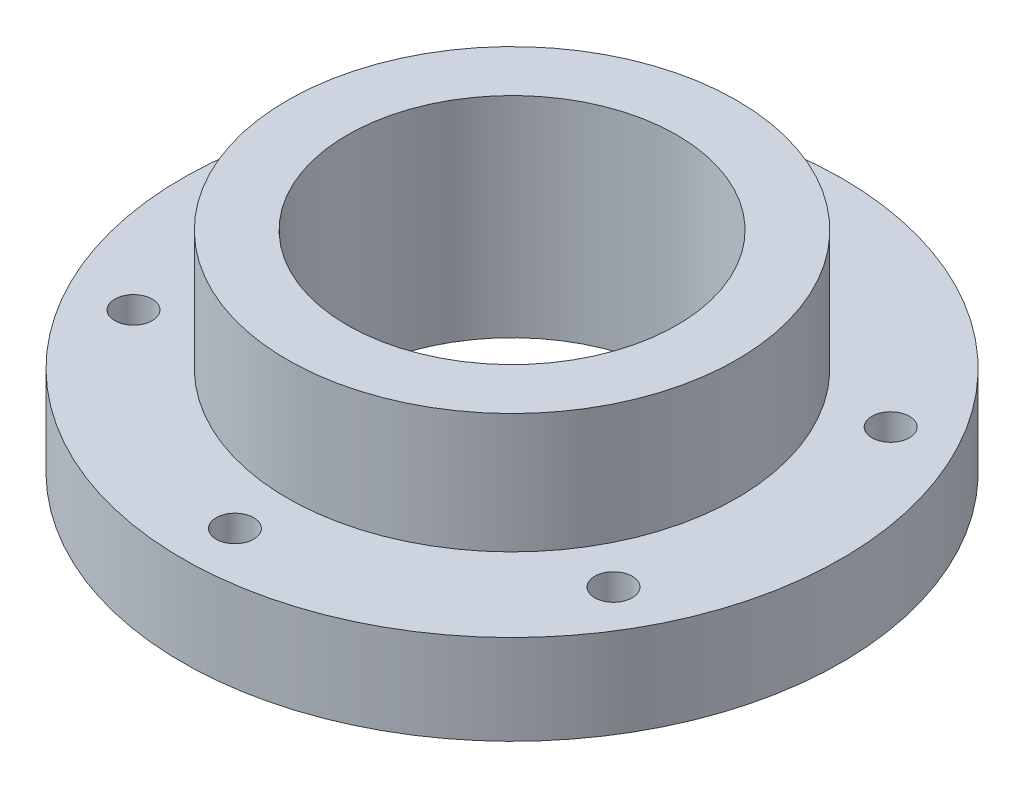
ISO-10303-21;
HEADER;
FILE_DESCRIPTION(('STEP AP214'),'2;1');
FILE_NAME('part.step','',(''),(''),'','','');
FILE_SCHEMA(('AUTOMOTIVE_DESIGN { 1 0 10303 214 1 1 1 1 }'));
ENDSEC;
DATA;
#1=APPLICATION_CONTEXT('core data for automotive mechanical design processes');
#2=APPLICATION_PROTOCOL_DEFINITION('international standard','automotive_design',2000,#1);
#3=PRODUCT_CONTEXT('',#1,'mechanical');
#4=PRODUCT('Part','Part','',(#3));
#5=PRODUCT_RELATED_PRODUCT_CATEGORY('part','',(#4));
#6=PRODUCT_DEFINITION_FORMATION('','',#4);
#7=PRODUCT_DEFINITION_CONTEXT('part definition',#1,'design');
#8=PRODUCT_DEFINITION('design','',#6,#7);
#9=PRODUCT_DEFINITION_SHAPE('','',#8);
#10=(LENGTH_UNIT() NAMED_UNIT(*) SI_UNIT(.MILLI.,.METRE.));
#11=(NAMED_UNIT(*) PLANE_ANGLE_UNIT() SI_UNIT($,.RADIAN.));
#12=(NAMED_UNIT(*) SI_UNIT($,.STERADIAN.) SOLID_ANGLE_UNIT());
#13=UNCERTAINTY_MEASURE_WITH_UNIT(LENGTH_MEASURE(1.E-05),#10,'distance_accuracy_value','');
#14=(GEOMETRIC_REPRESENTATION_CONTEXT(3) GLOBAL_UNCERTAINTY_ASSIGNED_CONTEXT((#13)) GLOBAL_UNIT_ASSIGNED_CONTEXT((#10,
#11,#12)) REPRESENTATION_CONTEXT('',''));
#15=CARTESIAN_POINT('',(0.,0.,0.));
#16=DIRECTION('',(0.,0.,1.));
#17=DIRECTION('',(1.,0.,0.));
#18=AXIS2_PLACEMENT_3D('',#15,#16,#17);
#19=CARTESIAN_POINT('',(22.,0.,0.));
#20=DIRECTION('',(0.,-1.,0.));
#21=DIRECTION('',(0.,0.,-1.));
#22=AXIS2_PLACEMENT_3D('',#19,#20,#21);
#23=PLANE('',#22);
#24=CARTESIAN_POINT('',(0.,0.,-18.5));
#25=DIRECTION('',(0.,-1.,0.));
#26=DIRECTION('',(0.,0.,-1.));
#27=AXIS2_PLACEMENT_3D('',#24,#25,#26);
#28=CIRCLE('',#27,1.25);
#29=CARTESIAN_POINT('',(0.,0.,-19.75));
#30=VERTEX_POINT('',#29);
#31=EDGE_CURVE('E56',#30,#30,#28,.T.);
#32=ORIENTED_EDGE('',*,*,#31,.F.);
#33=EDGE_LOOP('',(#32));
#34=FACE_BOUND('',#33,.T.);
#35=CARTESIAN_POINT('',(-16.0214699700108,0.,-9.24999999999771));
#36=DIRECTION('',(0.,-1.,0.));
#37=DIRECTION('',(0.,0.,-1.));
#38=AXIS2_PLACEMENT_3D('',#35,#36,#37);
#39=CIRCLE('',#38,1.25000000000214);
#40=CARTESIAN_POINT('',(-16.0214699700108,0.,-10.4999999999999));
#41=VERTEX_POINT('',#40);
#42=EDGE_CURVE('E59',#41,#41,#39,.T.);
#43=ORIENTED_EDGE('',*,*,#42,.F.);
#44=EDGE_LOOP('',(#43));
#45=FACE_BOUND('',#44,.T.);
#46=CARTESIAN_POINT('',(-16.0214699700082,0.,9.25000000000228));
#47=DIRECTION('',(0.,-1.,0.));
#48=DIRECTION('',(0.,0.,-1.));
#49=AXIS2_PLACEMENT_3D('',#46,#47,#48);
#50=CIRCLE('',#49,1.25000000000461);
#51=CARTESIAN_POINT('',(-16.0214699700082,0.,7.99999999999767));
#52=VERTEX_POINT('',#51);
#53=EDGE_CURVE('E62',#52,#52,#50,.T.);
#54=ORIENTED_EDGE('',*,*,#53,.F.);
#55=EDGE_LOOP('',(#54));
#56=FACE_BOUND('',#55,.T.);
#57=CARTESIAN_POINT('',(5.25305642508819E-12,0.,18.5));
#58=DIRECTION('',(0.,-1.,0.));
#59=DIRECTION('',(0.,0.,-1.));
#60=AXIS2_PLACEMENT_3D('',#57,#58,#59);
#61=CIRCLE('',#60,1.25000000000515);
#62=CARTESIAN_POINT('',(5.25305642508819E-12,0.,17.2499999999948));
#63=VERTEX_POINT('',#62);
#64=EDGE_CURVE('E65',#63,#63,#61,.T.);
#65=ORIENTED_EDGE('',*,*,#64,.F.);
#66=EDGE_LOOP('',(#65));
#67=FACE_BOUND('',#66,.T.);
#68=CARTESIAN_POINT('',(16.0214699700161,0.,9.24999999999772));
#69=DIRECTION('',(0.,-1.,0.));
#70=DIRECTION('',(0.,0.,-1.));
#71=AXIS2_PLACEMENT_3D('',#68,#69,#70);
#72=CIRCLE('',#71,1.25000000000319);
#73=CARTESIAN_POINT('',(16.0214699700161,0.,7.99999999999453));
#74=VERTEX_POINT('',#73);
#75=EDGE_CURVE('E68',#74,#74,#72,.T.);
#76=ORIENTED_EDGE('',*,*,#75,.F.);
#77=EDGE_LOOP('',(#76));
#78=FACE_BOUND('',#77,.T.);
#79=CARTESIAN_POINT('',(16.0214699700134,0.,-9.25000000000228));
#80=DIRECTION('',(0.,-1.,0.));
#81=DIRECTION('',(0.,0.,-1.));
#82=AXIS2_PLACEMENT_3D('',#79,#80,#81);
#83=CIRCLE('',#82,1.25000000000064);
#84=CARTESIAN_POINT('',(16.0214699700134,0.,-10.5000000000029));
#85=VERTEX_POINT('',#84);
#86=EDGE_CURVE('E71',#85,#85,#83,.T.);
#87=ORIENTED_EDGE('',*,*,#86,.F.);
#88=EDGE_LOOP('',(#87));
#89=FACE_BOUND('',#88,.T.);
#90=CARTESIAN_POINT('',(0.,0.,0.));
#91=DIRECTION('',(0.,-1.,0.));
#92=DIRECTION('',(0.,0.,-1.));
#93=AXIS2_PLACEMENT_3D('',#90,#91,#92);
#94=CIRCLE('',#93,22.);
#95=CARTESIAN_POINT('',(0.,0.,-22.));
#96=VERTEX_POINT('',#95);
#97=EDGE_CURVE('E53',#96,#96,#94,.T.);
#98=ORIENTED_EDGE('',*,*,#97,.T.);
#99=EDGE_LOOP('',(#98));
#100=FACE_BOUND('',#99,.T.);
#101=CARTESIAN_POINT('',(0.,0.,0.));
#102=DIRECTION('',(0.,-1.,0.));
#103=DIRECTION('',(0.,0.,-1.));
#104=AXIS2_PLACEMENT_3D('',#101,#102,#103);
#105=CIRCLE('',#104,11.);
#106=CARTESIAN_POINT('',(0.,0.,-11.));
#107=VERTEX_POINT('',#106);
#108=EDGE_CURVE('E10',#107,#107,#105,.T.);
#109=ORIENTED_EDGE('',*,*,#108,.F.);
#110=EDGE_LOOP('',(#109));
#111=FACE_BOUND('',#110,.T.);
#112=ADVANCED_FACE('F31',(#34,#45,#56,#67,#78,#89,#100,#111),#23,.T.);
#113=CARTESIAN_POINT('',(0.,0.,0.));
#114=DIRECTION('',(0.,-1.,0.));
#115=DIRECTION('',(0.,0.,-1.));
#116=AXIS2_PLACEMENT_3D('',#113,#114,#115);
#117=CYLINDRICAL_SURFACE('',#116,11.);
#118=ORIENTED_EDGE('',*,*,#108,.T.);
#119=EDGE_LOOP('',(#118));
#120=FACE_BOUND('',#119,.T.);
#121=CARTESIAN_POINT('',(0.,14.,0.));
#122=DIRECTION('',(0.,-1.,0.));
#123=DIRECTION('',(0.,0.,-1.));
#124=AXIS2_PLACEMENT_3D('',#121,#122,#123);
#125=CIRCLE('',#124,11.);
#126=CARTESIAN_POINT('',(0.,14.,-11.));
#127=VERTEX_POINT('',#126);
#128=EDGE_CURVE('E37',#127,#127,#125,.T.);
#129=ORIENTED_EDGE('',*,*,#128,.F.);
#130=EDGE_LOOP('',(#129));
#131=FACE_BOUND('',#130,.T.);
#132=ADVANCED_FACE('F123',(#120,#131),#117,.F.);
#133=CARTESIAN_POINT('',(11.,14.,0.));
#134=DIRECTION('',(0.,1.,0.));
#135=DIRECTION('',(0.,0.,1.));
#136=AXIS2_PLACEMENT_3D('',#133,#134,#135);
#137=PLANE('',#136);
#138=ORIENTED_EDGE('',*,*,#128,.T.);
#139=EDGE_LOOP('',(#138));
#140=FACE_BOUND('',#139,.T.);
#141=CARTESIAN_POINT('',(0.,14.,0.));
#142=DIRECTION('',(0.,-1.,0.));
#143=DIRECTION('',(0.,0.,-1.));
#144=AXIS2_PLACEMENT_3D('',#141,#142,#143);
#145=CIRCLE('',#144,15.);
#146=CARTESIAN_POINT('',(0.,14.,-15.));
#147=VERTEX_POINT('',#146);
#148=EDGE_CURVE('E41',#147,#147,#145,.T.);
#149=ORIENTED_EDGE('',*,*,#148,.F.);
#150=EDGE_LOOP('',(#149));
#151=FACE_BOUND('',#150,.T.);
#152=ADVANCED_FACE('F128',(#140,#151),#137,.T.);
#153=CARTESIAN_POINT('',(0.,0.,0.));
#154=DIRECTION('',(0.,-1.,0.));
#155=DIRECTION('',(0.,0.,-1.));
#156=AXIS2_PLACEMENT_3D('',#153,#154,#155);
#157=CYLINDRICAL_SURFACE('',#156,15.);
#158=ORIENTED_EDGE('',*,*,#148,.T.);
#159=EDGE_LOOP('',(#158));
#160=FACE_BOUND('',#159,.T.);
#161=CARTESIAN_POINT('',(0.,6.,0.));
#162=DIRECTION('',(0.,-1.,0.));
#163=DIRECTION('',(0.,0.,-1.));
#164=AXIS2_PLACEMENT_3D('',#161,#162,#163);
#165=CIRCLE('',#164,15.);
#166=CARTESIAN_POINT('',(0.,6.,-15.));
#167=VERTEX_POINT('',#166);
#168=EDGE_CURVE('E45',#167,#167,#165,.T.);
#169=ORIENTED_EDGE('',*,*,#168,.F.);
#170=EDGE_LOOP('',(#169));
#171=FACE_BOUND('',#170,.T.);
#172=ADVANCED_FACE('F99',(#160,#171),#157,.T.);
#173=CARTESIAN_POINT('',(15.,6.,0.));
#174=DIRECTION('',(0.,1.,0.));
#175=DIRECTION('',(0.,0.,1.));
#176=AXIS2_PLACEMENT_3D('',#173,#174,#175);
#177=PLANE('',#176);
#178=CARTESIAN_POINT('',(0.,6.,-18.5));
#179=DIRECTION('',(0.,1.,0.));
#180=DIRECTION('',(0.,0.,1.));
#181=AXIS2_PLACEMENT_3D('',#178,#179,#180);
#182=CIRCLE('',#181,1.25);
#183=CARTESIAN_POINT('',(0.,6.,-17.25));
#184=VERTEX_POINT('',#183);
#185=EDGE_CURVE('E74',#184,#184,#182,.T.);
#186=ORIENTED_EDGE('',*,*,#185,.F.);
#187=EDGE_LOOP('',(#186));
#188=FACE_BOUND('',#187,.T.);
#189=CARTESIAN_POINT('',(-16.0214699700108,6.,-9.24999999999771));
#190=DIRECTION('',(0.,1.,0.));
#191=DIRECTION('',(0.,0.,1.));
#192=AXIS2_PLACEMENT_3D('',#189,#190,#191);
#193=CIRCLE('',#192,1.25000000000214);
#194=CARTESIAN_POINT('',(-16.0214699700108,6.,-7.99999999999557));
#195=VERTEX_POINT('',#194);
#196=EDGE_CURVE('E79',#195,#195,#193,.T.);
#197=ORIENTED_EDGE('',*,*,#196,.F.);
#198=EDGE_LOOP('',(#197));
#199=FACE_BOUND('',#198,.T.);
#200=CARTESIAN_POINT('',(-16.0214699700082,6.,9.25000000000228));
#201=DIRECTION('',(0.,1.,0.));
#202=DIRECTION('',(0.,0.,1.));
#203=AXIS2_PLACEMENT_3D('',#200,#201,#202);
#204=CIRCLE('',#203,1.25000000000461);
#205=CARTESIAN_POINT('',(-16.0214699700082,6.,10.5000000000069));
#206=VERTEX_POINT('',#205);
#207=EDGE_CURVE('E75',#206,#206,#204,.T.);
#208=ORIENTED_EDGE('',*,*,#207,.F.);
#209=EDGE_LOOP('',(#208));
#210=FACE_BOUND('',#209,.T.);
#211=CARTESIAN_POINT('',(5.25305642508819E-12,6.,18.5));
#212=DIRECTION('',(0.,1.,0.));
#213=DIRECTION('',(0.,0.,1.));
#214=AXIS2_PLACEMENT_3D('',#211,#212,#213);
#215=CIRCLE('',#214,1.25000000000515);
#216=CARTESIAN_POINT('',(5.25305642508819E-12,6.,19.7500000000051));
#217=VERTEX_POINT('',#216);
#218=EDGE_CURVE('E78',#217,#217,#215,.T.);
#219=ORIENTED_EDGE('',*,*,#218,.F.);
#220=EDGE_LOOP('',(#219));
#221=FACE_BOUND('',#220,.T.);
#222=CARTESIAN_POINT('',(16.0214699700161,6.,9.24999999999772));
#223=DIRECTION('',(0.,1.,0.));
#224=DIRECTION('',(0.,0.,1.));
#225=AXIS2_PLACEMENT_3D('',#222,#223,#224);
#226=CIRCLE('',#225,1.25000000000319);
#227=CARTESIAN_POINT('',(16.0214699700161,6.,10.5000000000009));
#228=VERTEX_POINT('',#227);
#229=EDGE_CURVE('E82',#228,#228,#226,.T.);
#230=ORIENTED_EDGE('',*,*,#229,.F.);
#231=EDGE_LOOP('',(#230));
#232=FACE_BOUND('',#231,.T.);
#233=CARTESIAN_POINT('',(16.0214699700134,6.,-9.25000000000228));
#234=DIRECTION('',(0.,1.,0.));
#235=DIRECTION('',(0.,0.,1.));
#236=AXIS2_PLACEMENT_3D('',#233,#234,#235);
#237=CIRCLE('',#236,1.25000000000064);
#238=CARTESIAN_POINT('',(16.0214699700134,6.,-8.00000000000164));
#239=VERTEX_POINT('',#238);
#240=EDGE_CURVE('E85',#239,#239,#237,.T.);
#241=ORIENTED_EDGE('',*,*,#240,.F.);
#242=EDGE_LOOP('',(#241));
#243=FACE_BOUND('',#242,.T.);
#244=ORIENTED_EDGE('',*,*,#168,.T.);
#245=EDGE_LOOP('',(#244));
#246=FACE_BOUND('',#245,.T.);
#247=CARTESIAN_POINT('',(0.,6.,0.));
#248=DIRECTION('',(0.,-1.,0.));
#249=DIRECTION('',(0.,0.,-1.));
#250=AXIS2_PLACEMENT_3D('',#247,#248,#249);
#251=CIRCLE('',#250,22.);
#252=CARTESIAN_POINT('',(0.,6.,-22.));
#253=VERTEX_POINT('',#252);
#254=EDGE_CURVE('E50',#253,#253,#251,.T.);
#255=ORIENTED_EDGE('',*,*,#254,.F.);
#256=EDGE_LOOP('',(#255));
#257=FACE_BOUND('',#256,.T.);
#258=ADVANCED_FACE('F95',(#188,#199,#210,#221,#232,#243,#246,#257),#177,.T.);
#259=CARTESIAN_POINT('',(0.,0.,0.));
#260=DIRECTION('',(0.,-1.,0.));
#261=DIRECTION('',(0.,0.,-1.));
#262=AXIS2_PLACEMENT_3D('',#259,#260,#261);
#263=CYLINDRICAL_SURFACE('',#262,22.);
#264=ORIENTED_EDGE('',*,*,#254,.T.);
#265=EDGE_LOOP('',(#264));
#266=FACE_BOUND('',#265,.T.);
#267=ORIENTED_EDGE('',*,*,#97,.F.);
#268=EDGE_LOOP('',(#267));
#269=FACE_BOUND('',#268,.T.);
#270=ADVANCED_FACE('F98',(#266,#269),#263,.T.);
#271=CARTESIAN_POINT('',(16.0214699700134,-4.,-9.25000000000228));
#272=DIRECTION('',(0.,1.,0.));
#273=DIRECTION('',(0.,0.,1.));
#274=AXIS2_PLACEMENT_3D('',#271,#272,#273);
#275=CYLINDRICAL_SURFACE('',#274,1.25000000000064);
#276=ORIENTED_EDGE('',*,*,#86,.T.);
#277=EDGE_LOOP('',(#276));
#278=FACE_BOUND('',#277,.T.);
#279=ORIENTED_EDGE('',*,*,#240,.T.);
#280=EDGE_LOOP('',(#279));
#281=FACE_BOUND('',#280,.T.);
#282=ADVANCED_FACE('F117',(#278,#281),#275,.F.);
#283=CARTESIAN_POINT('',(16.0214699700161,-4.,9.24999999999772));
#284=DIRECTION('',(0.,1.,0.));
#285=DIRECTION('',(0.,0.,1.));
#286=AXIS2_PLACEMENT_3D('',#283,#284,#285);
#287=CYLINDRICAL_SURFACE('',#286,1.25000000000319);
#288=ORIENTED_EDGE('',*,*,#75,.T.);
#289=EDGE_LOOP('',(#288));
#290=FACE_BOUND('',#289,.T.);
#291=ORIENTED_EDGE('',*,*,#229,.T.);
#292=EDGE_LOOP('',(#291));
#293=FACE_BOUND('',#292,.T.);
#294=ADVANCED_FACE('F143',(#290,#293),#287,.F.);
#295=CARTESIAN_POINT('',(5.25305642508819E-12,-4.,18.5));
#296=DIRECTION('',(0.,1.,0.));
#297=DIRECTION('',(0.,0.,1.));
#298=AXIS2_PLACEMENT_3D('',#295,#296,#297);
#299=CYLINDRICAL_SURFACE('',#298,1.25000000000515);
#300=ORIENTED_EDGE('',*,*,#64,.T.);
#301=EDGE_LOOP('',(#300));
#302=FACE_BOUND('',#301,.T.);
#303=ORIENTED_EDGE('',*,*,#218,.T.);
#304=EDGE_LOOP('',(#303));
#305=FACE_BOUND('',#304,.T.);
#306=ADVANCED_FACE('F148',(#302,#305),#299,.F.);
#307=CARTESIAN_POINT('',(-16.0214699700082,-4.,9.25000000000228));
#308=DIRECTION('',(0.,1.,0.));
#309=DIRECTION('',(0.,0.,1.));
#310=AXIS2_PLACEMENT_3D('',#307,#308,#309);
#311=CYLINDRICAL_SURFACE('',#310,1.25000000000461);
#312=ORIENTED_EDGE('',*,*,#53,.T.);
#313=EDGE_LOOP('',(#312));
#314=FACE_BOUND('',#313,.T.);
#315=ORIENTED_EDGE('',*,*,#207,.T.);
#316=EDGE_LOOP('',(#315));
#317=FACE_BOUND('',#316,.T.);
#318=ADVANCED_FACE('F157',(#314,#317),#311,.F.);
#319=CARTESIAN_POINT('',(-16.0214699700108,-4.,-9.24999999999771));
#320=DIRECTION('',(0.,1.,0.));
#321=DIRECTION('',(0.,0.,1.));
#322=AXIS2_PLACEMENT_3D('',#319,#320,#321);
#323=CYLINDRICAL_SURFACE('',#322,1.25000000000214);
#324=ORIENTED_EDGE('',*,*,#42,.T.);
#325=EDGE_LOOP('',(#324));
#326=FACE_BOUND('',#325,.T.);
#327=ORIENTED_EDGE('',*,*,#196,.T.);
#328=EDGE_LOOP('',(#327));
#329=FACE_BOUND('',#328,.T.);
#330=ADVANCED_FACE('F152',(#326,#329),#323,.F.);
#331=CARTESIAN_POINT('',(0.,-4.,-18.5));
#332=DIRECTION('',(0.,1.,0.));
#333=DIRECTION('',(0.,0.,1.));
#334=AXIS2_PLACEMENT_3D('',#331,#332,#333);
#335=CYLINDRICAL_SURFACE('',#334,1.25);
#336=ORIENTED_EDGE('',*,*,#31,.T.);
#337=EDGE_LOOP('',(#336));
#338=FACE_BOUND('',#337,.T.);
#339=ORIENTED_EDGE('',*,*,#185,.T.);
#340=EDGE_LOOP('',(#339));
#341=FACE_BOUND('',#340,.T.);
#342=ADVANCED_FACE('F93',(#338,#341),#335,.F.);
#343=CLOSED_SHELL('',(#112,#132,#152,#172,#258,#270,#282,#294,#306,#318,#330,#342));
#344=MANIFOLD_SOLID_BREP('B2',#343);
#345=ADVANCED_BREP_SHAPE_REPRESENTATION('',(#18,#344),#14);
#346=SHAPE_DEFINITION_REPRESENTATION(#9,#345);
ENDSEC;
END-ISO-10303-21;
